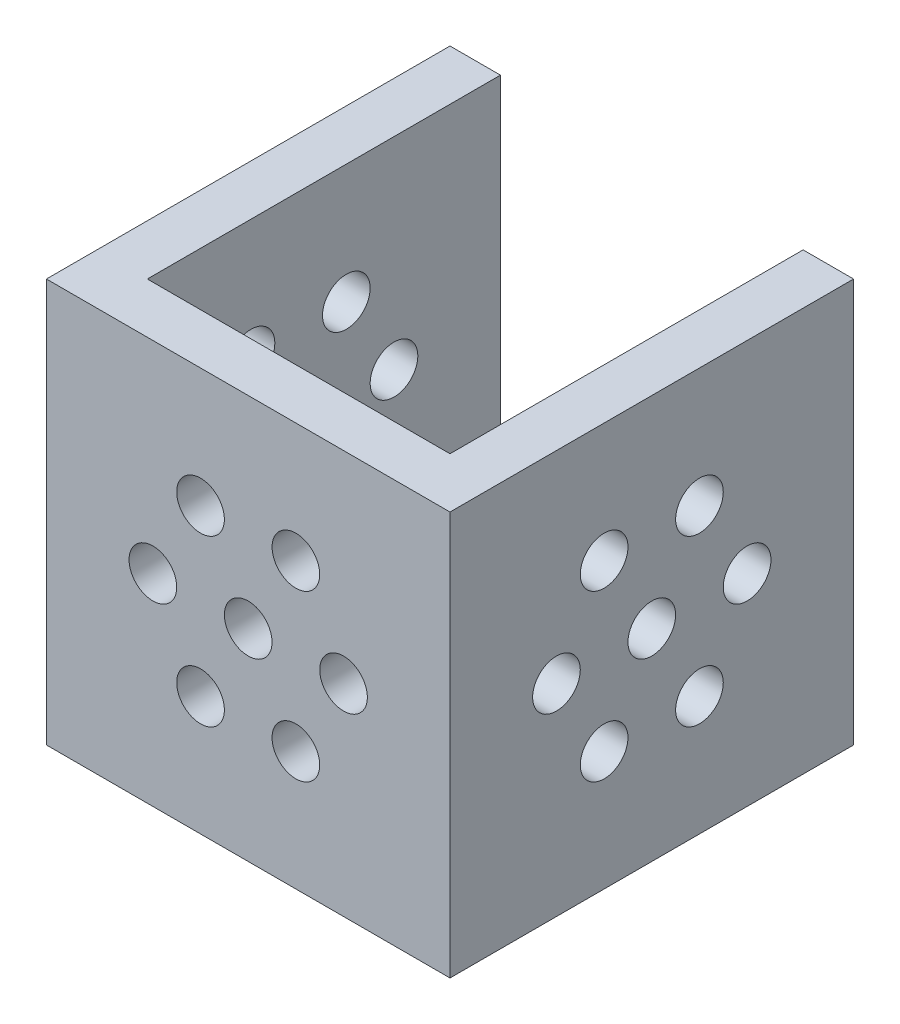
ISO-10303-21;
HEADER;
FILE_DESCRIPTION(('STEP AP214'),'2;1');
FILE_NAME('part.step','',(''),(''),'','','');
FILE_SCHEMA(('AUTOMOTIVE_DESIGN { 1 0 10303 214 1 1 1 1 }'));
ENDSEC;
DATA;
#1=APPLICATION_CONTEXT('core data for automotive mechanical design processes');
#2=APPLICATION_PROTOCOL_DEFINITION('international standard','automotive_design',2000,#1);
#3=PRODUCT_CONTEXT('',#1,'mechanical');
#4=PRODUCT('Part','Part','',(#3));
#5=PRODUCT_RELATED_PRODUCT_CATEGORY('part','',(#4));
#6=PRODUCT_DEFINITION_FORMATION('','',#4);
#7=PRODUCT_DEFINITION_CONTEXT('part definition',#1,'design');
#8=PRODUCT_DEFINITION('design','',#6,#7);
#9=PRODUCT_DEFINITION_SHAPE('','',#8);
#10=(LENGTH_UNIT() NAMED_UNIT(*) SI_UNIT(.MILLI.,.METRE.));
#11=(NAMED_UNIT(*) PLANE_ANGLE_UNIT() SI_UNIT($,.RADIAN.));
#12=(NAMED_UNIT(*) SI_UNIT($,.STERADIAN.) SOLID_ANGLE_UNIT());
#13=UNCERTAINTY_MEASURE_WITH_UNIT(LENGTH_MEASURE(1.E-05),#10,'distance_accuracy_value','');
#14=(GEOMETRIC_REPRESENTATION_CONTEXT(3) GLOBAL_UNCERTAINTY_ASSIGNED_CONTEXT((#13)) GLOBAL_UNIT_ASSIGNED_CONTEXT((#10,
#11,#12)) REPRESENTATION_CONTEXT('',''));
#15=CARTESIAN_POINT('',(0.,0.,0.));
#16=DIRECTION('',(0.,0.,1.));
#17=DIRECTION('',(1.,0.,0.));
#18=AXIS2_PLACEMENT_3D('',#15,#16,#17);
#19=CARTESIAN_POINT('',(22.225,25.4,0.));
#20=DIRECTION('',(-1.,0.,0.));
#21=DIRECTION('',(0.,0.,1.));
#22=AXIS2_PLACEMENT_3D('',#19,#20,#21);
#23=PLANE('',#22);
#24=CARTESIAN_POINT('',(22.225,12.7,-12.7));
#25=DIRECTION('',(-1.,0.,0.));
#26=DIRECTION('',(0.,0.,1.));
#27=AXIS2_PLACEMENT_3D('',#24,#25,#26);
#28=CIRCLE('',#27,1.5);
#29=CARTESIAN_POINT('',(22.225,12.7,-11.2));
#30=VERTEX_POINT('',#29);
#31=EDGE_CURVE('E214',#30,#30,#28,.T.);
#32=ORIENTED_EDGE('',*,*,#31,.F.);
#33=EDGE_LOOP('',(#32));
#34=FACE_BOUND('',#33,.T.);
#35=CARTESIAN_POINT('',(22.225,7.5038475772934,-9.69999999999994));
#36=DIRECTION('',(-1.,0.,0.));
#37=DIRECTION('',(0.,0.,1.));
#38=AXIS2_PLACEMENT_3D('',#35,#36,#37);
#39=CIRCLE('',#38,1.5);
#40=CARTESIAN_POINT('',(22.225,7.5038475772934,-8.19999999999995));
#41=VERTEX_POINT('',#40);
#42=EDGE_CURVE('E218',#41,#41,#39,.T.);
#43=ORIENTED_EDGE('',*,*,#42,.F.);
#44=EDGE_LOOP('',(#43));
#45=FACE_BOUND('',#44,.T.);
#46=CARTESIAN_POINT('',(22.225,7.50384757729334,-15.6999999999999));
#47=DIRECTION('',(-1.,0.,0.));
#48=DIRECTION('',(0.,0.,1.));
#49=AXIS2_PLACEMENT_3D('',#46,#47,#48);
#50=CIRCLE('',#49,1.5);
#51=CARTESIAN_POINT('',(22.225,7.50384757729334,-14.2));
#52=VERTEX_POINT('',#51);
#53=EDGE_CURVE('E222',#52,#52,#50,.T.);
#54=ORIENTED_EDGE('',*,*,#53,.F.);
#55=EDGE_LOOP('',(#54));
#56=FACE_BOUND('',#55,.T.);
#57=CARTESIAN_POINT('',(22.225,12.7,-18.7));
#58=DIRECTION('',(-1.,0.,0.));
#59=DIRECTION('',(0.,0.,1.));
#60=AXIS2_PLACEMENT_3D('',#57,#58,#59);
#61=CIRCLE('',#60,1.5);
#62=CARTESIAN_POINT('',(22.225,12.7,-17.2));
#63=VERTEX_POINT('',#62);
#64=EDGE_CURVE('E226',#63,#63,#61,.T.);
#65=ORIENTED_EDGE('',*,*,#64,.F.);
#66=EDGE_LOOP('',(#65));
#67=FACE_BOUND('',#66,.T.);
#68=CARTESIAN_POINT('',(22.225,12.7,-6.7));
#69=DIRECTION('',(-1.,0.,0.));
#70=DIRECTION('',(0.,0.,1.));
#71=AXIS2_PLACEMENT_3D('',#68,#69,#70);
#72=CIRCLE('',#71,1.5);
#73=CARTESIAN_POINT('',(22.225,12.7,-5.2));
#74=VERTEX_POINT('',#73);
#75=EDGE_CURVE('E230',#74,#74,#72,.T.);
#76=ORIENTED_EDGE('',*,*,#75,.F.);
#77=EDGE_LOOP('',(#76));
#78=FACE_BOUND('',#77,.T.);
#79=CARTESIAN_POINT('',(22.225,17.8961524227066,-9.70000000000001));
#80=DIRECTION('',(-1.,0.,0.));
#81=DIRECTION('',(0.,0.,1.));
#82=AXIS2_PLACEMENT_3D('',#79,#80,#81);
#83=CIRCLE('',#82,1.49999999999999);
#84=CARTESIAN_POINT('',(22.225,17.8961524227066,-8.20000000000002));
#85=VERTEX_POINT('',#84);
#86=EDGE_CURVE('E234',#85,#85,#83,.T.);
#87=ORIENTED_EDGE('',*,*,#86,.F.);
#88=EDGE_LOOP('',(#87));
#89=FACE_BOUND('',#88,.T.);
#90=CARTESIAN_POINT('',(22.225,17.8961524227066,-15.7));
#91=DIRECTION('',(-1.,0.,0.));
#92=DIRECTION('',(0.,0.,1.));
#93=AXIS2_PLACEMENT_3D('',#90,#91,#92);
#94=CIRCLE('',#93,1.5);
#95=CARTESIAN_POINT('',(22.225,17.8961524227066,-14.2));
#96=VERTEX_POINT('',#95);
#97=EDGE_CURVE('E237',#96,#96,#94,.T.);
#98=ORIENTED_EDGE('',*,*,#97,.F.);
#99=EDGE_LOOP('',(#98));
#100=FACE_BOUND('',#99,.T.);
#101=DIRECTION('',(0.,0.,-1.));
#102=VECTOR('',#101,1.);
#103=CARTESIAN_POINT('',(22.225,0.,0.));
#104=LINE('',#103,#102);
#105=CARTESIAN_POINT('',(22.225,0.,-3.175));
#106=VERTEX_POINT('',#105);
#107=CARTESIAN_POINT('',(22.225,0.,-25.4));
#108=VERTEX_POINT('',#107);
#109=EDGE_CURVE('E138',#106,#108,#104,.T.);
#110=ORIENTED_EDGE('',*,*,#109,.F.);
#111=DIRECTION('',(0.,-1.,0.));
#112=VECTOR('',#111,1.);
#113=CARTESIAN_POINT('',(22.225,25.4,-3.175));
#114=LINE('',#113,#112);
#115=CARTESIAN_POINT('',(22.225,25.4,-3.175));
#116=VERTEX_POINT('',#115);
#117=EDGE_CURVE('E12',#116,#106,#114,.T.);
#118=ORIENTED_EDGE('',*,*,#117,.F.);
#119=DIRECTION('',(0.,0.,-1.));
#120=VECTOR('',#119,1.);
#121=CARTESIAN_POINT('',(22.225,25.4,0.));
#122=LINE('',#121,#120);
#123=CARTESIAN_POINT('',(22.225,25.4,-25.4));
#124=VERTEX_POINT('',#123);
#125=EDGE_CURVE('E180',#116,#124,#122,.T.);
#126=ORIENTED_EDGE('',*,*,#125,.T.);
#127=DIRECTION('',(0.,-1.,0.));
#128=VECTOR('',#127,1.);
#129=CARTESIAN_POINT('',(22.225,25.4,-25.4));
#130=LINE('',#129,#128);
#131=EDGE_CURVE('E60',#124,#108,#130,.T.);
#132=ORIENTED_EDGE('',*,*,#131,.T.);
#133=EDGE_LOOP('',(#110,#118,#126,#132));
#134=FACE_BOUND('',#133,.T.);
#135=ADVANCED_FACE('F44',(#34,#45,#56,#67,#78,#89,#100,#134),#23,.T.);
#136=CARTESIAN_POINT('',(0.,25.4,-3.175));
#137=DIRECTION('',(0.,0.,-1.));
#138=DIRECTION('',(-1.,0.,0.));
#139=AXIS2_PLACEMENT_3D('',#136,#137,#138);
#140=PLANE('',#139);
#141=CARTESIAN_POINT('',(9.7,17.8961524227066,-3.175));
#142=DIRECTION('',(0.,0.,-1.));
#143=DIRECTION('',(-1.,0.,0.));
#144=AXIS2_PLACEMENT_3D('',#141,#142,#143);
#145=CIRCLE('',#144,1.5);
#146=CARTESIAN_POINT('',(8.2,17.8961524227066,-3.175));
#147=VERTEX_POINT('',#146);
#148=EDGE_CURVE('E141',#147,#147,#145,.T.);
#149=ORIENTED_EDGE('',*,*,#148,.F.);
#150=EDGE_LOOP('',(#149));
#151=FACE_BOUND('',#150,.T.);
#152=CARTESIAN_POINT('',(18.7,12.7,-3.175));
#153=DIRECTION('',(0.,0.,-1.));
#154=DIRECTION('',(-1.,0.,0.));
#155=AXIS2_PLACEMENT_3D('',#152,#153,#154);
#156=CIRCLE('',#155,1.5);
#157=CARTESIAN_POINT('',(17.2,12.7,-3.175));
#158=VERTEX_POINT('',#157);
#159=EDGE_CURVE('E305',#158,#158,#156,.T.);
#160=ORIENTED_EDGE('',*,*,#159,.F.);
#161=EDGE_LOOP('',(#160));
#162=FACE_BOUND('',#161,.T.);
#163=CARTESIAN_POINT('',(15.7,7.50384757729337,-3.175));
#164=DIRECTION('',(0.,0.,-1.));
#165=DIRECTION('',(-1.,0.,0.));
#166=AXIS2_PLACEMENT_3D('',#163,#164,#165);
#167=CIRCLE('',#166,1.49999999999999);
#168=CARTESIAN_POINT('',(14.2,7.50384757729337,-3.175));
#169=VERTEX_POINT('',#168);
#170=EDGE_CURVE('E303',#169,#169,#167,.T.);
#171=ORIENTED_EDGE('',*,*,#170,.F.);
#172=EDGE_LOOP('',(#171));
#173=FACE_BOUND('',#172,.T.);
#174=CARTESIAN_POINT('',(9.7,7.50384757729337,-3.175));
#175=DIRECTION('',(0.,0.,-1.));
#176=DIRECTION('',(-1.,0.,0.));
#177=AXIS2_PLACEMENT_3D('',#174,#175,#176);
#178=CIRCLE('',#177,1.5);
#179=CARTESIAN_POINT('',(8.2,7.50384757729337,-3.175));
#180=VERTEX_POINT('',#179);
#181=EDGE_CURVE('E300',#180,#180,#178,.T.);
#182=ORIENTED_EDGE('',*,*,#181,.F.);
#183=EDGE_LOOP('',(#182));
#184=FACE_BOUND('',#183,.T.);
#185=CARTESIAN_POINT('',(15.7,17.8961524227066,-3.175));
#186=DIRECTION('',(0.,0.,-1.));
#187=DIRECTION('',(-1.,0.,0.));
#188=AXIS2_PLACEMENT_3D('',#185,#186,#187);
#189=CIRCLE('',#188,1.49999999999999);
#190=CARTESIAN_POINT('',(14.2,17.8961524227066,-3.175));
#191=VERTEX_POINT('',#190);
#192=EDGE_CURVE('E297',#191,#191,#189,.T.);
#193=ORIENTED_EDGE('',*,*,#192,.F.);
#194=EDGE_LOOP('',(#193));
#195=FACE_BOUND('',#194,.T.);
#196=CARTESIAN_POINT('',(12.7,12.7,-3.175));
#197=DIRECTION('',(0.,0.,-1.));
#198=DIRECTION('',(-1.,0.,0.));
#199=AXIS2_PLACEMENT_3D('',#196,#197,#198);
#200=CIRCLE('',#199,1.5);
#201=CARTESIAN_POINT('',(11.2,12.7,-3.175));
#202=VERTEX_POINT('',#201);
#203=EDGE_CURVE('E294',#202,#202,#200,.T.);
#204=ORIENTED_EDGE('',*,*,#203,.F.);
#205=EDGE_LOOP('',(#204));
#206=FACE_BOUND('',#205,.T.);
#207=CARTESIAN_POINT('',(6.7,12.7,-3.175));
#208=DIRECTION('',(0.,0.,-1.));
#209=DIRECTION('',(-1.,0.,0.));
#210=AXIS2_PLACEMENT_3D('',#207,#208,#209);
#211=CIRCLE('',#210,1.5);
#212=CARTESIAN_POINT('',(5.2,12.7,-3.175));
#213=VERTEX_POINT('',#212);
#214=EDGE_CURVE('E291',#213,#213,#211,.T.);
#215=ORIENTED_EDGE('',*,*,#214,.F.);
#216=EDGE_LOOP('',(#215));
#217=FACE_BOUND('',#216,.T.);
#218=DIRECTION('',(1.,0.,0.));
#219=VECTOR('',#218,1.);
#220=CARTESIAN_POINT('',(0.,0.,-3.175));
#221=LINE('',#220,#219);
#222=CARTESIAN_POINT('',(3.175,0.,-3.175));
#223=VERTEX_POINT('',#222);
#224=EDGE_CURVE('E140',#223,#106,#221,.T.);
#225=ORIENTED_EDGE('',*,*,#224,.F.);
#226=DIRECTION('',(0.,-1.,0.));
#227=VECTOR('',#226,1.);
#228=CARTESIAN_POINT('',(3.175,25.4,-3.175));
#229=LINE('',#228,#227);
#230=CARTESIAN_POINT('',(3.175,25.4,-3.175));
#231=VERTEX_POINT('',#230);
#232=EDGE_CURVE('E52',#231,#223,#229,.T.);
#233=ORIENTED_EDGE('',*,*,#232,.F.);
#234=DIRECTION('',(1.,0.,0.));
#235=VECTOR('',#234,1.);
#236=CARTESIAN_POINT('',(0.,25.4,-3.175));
#237=LINE('',#236,#235);
#238=EDGE_CURVE('E177',#231,#116,#237,.T.);
#239=ORIENTED_EDGE('',*,*,#238,.T.);
#240=ORIENTED_EDGE('',*,*,#117,.T.);
#241=EDGE_LOOP('',(#225,#233,#239,#240));
#242=FACE_BOUND('',#241,.T.);
#243=ADVANCED_FACE('F176',(#151,#162,#173,#184,#195,#206,#217,#242),#140,.T.);
#244=CARTESIAN_POINT('',(3.175,25.4,0.));
#245=DIRECTION('',(-1.,0.,0.));
#246=DIRECTION('',(0.,0.,1.));
#247=AXIS2_PLACEMENT_3D('',#244,#245,#246);
#248=PLANE('',#247);
#249=CARTESIAN_POINT('',(3.175,12.7,-12.7));
#250=DIRECTION('',(-1.,0.,0.));
#251=DIRECTION('',(0.,0.,1.));
#252=AXIS2_PLACEMENT_3D('',#249,#250,#251);
#253=CIRCLE('',#252,1.5);
#254=CARTESIAN_POINT('',(3.175,12.7,-11.2));
#255=VERTEX_POINT('',#254);
#256=EDGE_CURVE('E266',#255,#255,#253,.T.);
#257=ORIENTED_EDGE('',*,*,#256,.T.);
#258=EDGE_LOOP('',(#257));
#259=FACE_BOUND('',#258,.T.);
#260=CARTESIAN_POINT('',(3.175,7.5038475772934,-9.69999999999994));
#261=DIRECTION('',(-1.,0.,0.));
#262=DIRECTION('',(0.,0.,1.));
#263=AXIS2_PLACEMENT_3D('',#260,#261,#262);
#264=CIRCLE('',#263,1.5);
#265=CARTESIAN_POINT('',(3.175,7.5038475772934,-8.19999999999995));
#266=VERTEX_POINT('',#265);
#267=EDGE_CURVE('E262',#266,#266,#264,.T.);
#268=ORIENTED_EDGE('',*,*,#267,.T.);
#269=EDGE_LOOP('',(#268));
#270=FACE_BOUND('',#269,.T.);
#271=CARTESIAN_POINT('',(3.175,7.50384757729334,-15.6999999999999));
#272=DIRECTION('',(-1.,0.,0.));
#273=DIRECTION('',(0.,0.,1.));
#274=AXIS2_PLACEMENT_3D('',#271,#272,#273);
#275=CIRCLE('',#274,1.5);
#276=CARTESIAN_POINT('',(3.175,7.50384757729334,-14.2));
#277=VERTEX_POINT('',#276);
#278=EDGE_CURVE('E258',#277,#277,#275,.T.);
#279=ORIENTED_EDGE('',*,*,#278,.T.);
#280=EDGE_LOOP('',(#279));
#281=FACE_BOUND('',#280,.T.);
#282=CARTESIAN_POINT('',(3.175,12.7,-18.7));
#283=DIRECTION('',(-1.,0.,0.));
#284=DIRECTION('',(0.,0.,1.));
#285=AXIS2_PLACEMENT_3D('',#282,#283,#284);
#286=CIRCLE('',#285,1.5);
#287=CARTESIAN_POINT('',(3.175,12.7,-17.2));
#288=VERTEX_POINT('',#287);
#289=EDGE_CURVE('E254',#288,#288,#286,.T.);
#290=ORIENTED_EDGE('',*,*,#289,.T.);
#291=EDGE_LOOP('',(#290));
#292=FACE_BOUND('',#291,.T.);
#293=CARTESIAN_POINT('',(3.175,12.7,-6.7));
#294=DIRECTION('',(-1.,0.,0.));
#295=DIRECTION('',(0.,0.,1.));
#296=AXIS2_PLACEMENT_3D('',#293,#294,#295);
#297=CIRCLE('',#296,1.5);
#298=CARTESIAN_POINT('',(3.175,12.7,-5.2));
#299=VERTEX_POINT('',#298);
#300=EDGE_CURVE('E250',#299,#299,#297,.T.);
#301=ORIENTED_EDGE('',*,*,#300,.T.);
#302=EDGE_LOOP('',(#301));
#303=FACE_BOUND('',#302,.T.);
#304=CARTESIAN_POINT('',(3.175,17.8961524227066,-9.70000000000001));
#305=DIRECTION('',(-1.,0.,0.));
#306=DIRECTION('',(0.,0.,1.));
#307=AXIS2_PLACEMENT_3D('',#304,#305,#306);
#308=CIRCLE('',#307,1.49999999999999);
#309=CARTESIAN_POINT('',(3.175,17.8961524227066,-8.20000000000002));
#310=VERTEX_POINT('',#309);
#311=EDGE_CURVE('E239',#310,#310,#308,.T.);
#312=ORIENTED_EDGE('',*,*,#311,.T.);
#313=EDGE_LOOP('',(#312));
#314=FACE_BOUND('',#313,.T.);
#315=CARTESIAN_POINT('',(3.175,17.8961524227066,-15.7));
#316=DIRECTION('',(-1.,0.,0.));
#317=DIRECTION('',(0.,0.,1.));
#318=AXIS2_PLACEMENT_3D('',#315,#316,#317);
#319=CIRCLE('',#318,1.5);
#320=CARTESIAN_POINT('',(3.175,17.8961524227066,-14.2));
#321=VERTEX_POINT('',#320);
#322=EDGE_CURVE('E240',#321,#321,#319,.T.);
#323=ORIENTED_EDGE('',*,*,#322,.T.);
#324=EDGE_LOOP('',(#323));
#325=FACE_BOUND('',#324,.T.);
#326=DIRECTION('',(0.,0.,-1.));
#327=VECTOR('',#326,1.);
#328=CARTESIAN_POINT('',(3.175,0.,0.));
#329=LINE('',#328,#327);
#330=CARTESIAN_POINT('',(3.175,0.,-25.4));
#331=VERTEX_POINT('',#330);
#332=EDGE_CURVE('E144',#223,#331,#329,.T.);
#333=ORIENTED_EDGE('',*,*,#332,.T.);
#334=DIRECTION('',(0.,-1.,0.));
#335=VECTOR('',#334,1.);
#336=CARTESIAN_POINT('',(3.175,25.4,-25.4));
#337=LINE('',#336,#335);
#338=CARTESIAN_POINT('',(3.175,25.4,-25.4));
#339=VERTEX_POINT('',#338);
#340=EDGE_CURVE('E162',#339,#331,#337,.T.);
#341=ORIENTED_EDGE('',*,*,#340,.F.);
#342=DIRECTION('',(0.,0.,-1.));
#343=VECTOR('',#342,1.);
#344=CARTESIAN_POINT('',(3.175,25.4,0.));
#345=LINE('',#344,#343);
#346=EDGE_CURVE('E168',#231,#339,#345,.T.);
#347=ORIENTED_EDGE('',*,*,#346,.F.);
#348=ORIENTED_EDGE('',*,*,#232,.T.);
#349=EDGE_LOOP('',(#333,#341,#347,#348));
#350=FACE_BOUND('',#349,.T.);
#351=ADVANCED_FACE('F166',(#259,#270,#281,#292,#303,#314,#325,#350),#248,.F.);
#352=CARTESIAN_POINT('',(0.,25.4,-25.4));
#353=DIRECTION('',(0.,0.,-1.));
#354=DIRECTION('',(-1.,0.,0.));
#355=AXIS2_PLACEMENT_3D('',#352,#353,#354);
#356=PLANE('',#355);
#357=DIRECTION('',(1.,0.,0.));
#358=VECTOR('',#357,1.);
#359=CARTESIAN_POINT('',(0.,0.,-25.4));
#360=LINE('',#359,#358);
#361=CARTESIAN_POINT('',(0.,0.,-25.4));
#362=VERTEX_POINT('',#361);
#363=EDGE_CURVE('E147',#362,#331,#360,.T.);
#364=ORIENTED_EDGE('',*,*,#363,.F.);
#365=DIRECTION('',(0.,-1.,0.));
#366=VECTOR('',#365,1.);
#367=CARTESIAN_POINT('',(0.,25.4,-25.4));
#368=LINE('',#367,#366);
#369=CARTESIAN_POINT('',(0.,25.4,-25.4));
#370=VERTEX_POINT('',#369);
#371=EDGE_CURVE('E160',#370,#362,#368,.T.);
#372=ORIENTED_EDGE('',*,*,#371,.F.);
#373=DIRECTION('',(1.,0.,0.));
#374=VECTOR('',#373,1.);
#375=CARTESIAN_POINT('',(0.,25.4,-25.4));
#376=LINE('',#375,#374);
#377=EDGE_CURVE('E135',#370,#339,#376,.T.);
#378=ORIENTED_EDGE('',*,*,#377,.T.);
#379=ORIENTED_EDGE('',*,*,#340,.T.);
#380=EDGE_LOOP('',(#364,#372,#378,#379));
#381=FACE_BOUND('',#380,.T.);
#382=ADVANCED_FACE('F191',(#381),#356,.T.);
#383=CARTESIAN_POINT('',(0.,25.4,0.));
#384=DIRECTION('',(-1.,0.,0.));
#385=DIRECTION('',(0.,0.,1.));
#386=AXIS2_PLACEMENT_3D('',#383,#384,#385);
#387=PLANE('',#386);
#388=CARTESIAN_POINT('',(0.,12.7,-12.7));
#389=DIRECTION('',(1.,0.,0.));
#390=DIRECTION('',(0.,0.,-1.));
#391=AXIS2_PLACEMENT_3D('',#388,#389,#390);
#392=CIRCLE('',#391,1.5);
#393=CARTESIAN_POINT('',(0.,12.7,-14.2));
#394=VERTEX_POINT('',#393);
#395=EDGE_CURVE('E588',#394,#394,#392,.T.);
#396=ORIENTED_EDGE('',*,*,#395,.T.);
#397=EDGE_LOOP('',(#396));
#398=FACE_BOUND('',#397,.T.);
#399=CARTESIAN_POINT('',(0.,7.5038475772934,-9.69999999999994));
#400=DIRECTION('',(1.,0.,0.));
#401=DIRECTION('',(0.,0.,-1.));
#402=AXIS2_PLACEMENT_3D('',#399,#400,#401);
#403=CIRCLE('',#402,1.5);
#404=CARTESIAN_POINT('',(0.,7.5038475772934,-11.1999999999999));
#405=VERTEX_POINT('',#404);
#406=EDGE_CURVE('E612',#405,#405,#403,.T.);
#407=ORIENTED_EDGE('',*,*,#406,.T.);
#408=EDGE_LOOP('',(#407));
#409=FACE_BOUND('',#408,.T.);
#410=CARTESIAN_POINT('',(0.,7.50384757729334,-15.6999999999999));
#411=DIRECTION('',(1.,0.,0.));
#412=DIRECTION('',(0.,0.,-1.));
#413=AXIS2_PLACEMENT_3D('',#410,#411,#412);
#414=CIRCLE('',#413,1.5);
#415=CARTESIAN_POINT('',(0.,7.50384757729334,-17.1999999999999));
#416=VERTEX_POINT('',#415);
#417=EDGE_CURVE('E626',#416,#416,#414,.T.);
#418=ORIENTED_EDGE('',*,*,#417,.T.);
#419=EDGE_LOOP('',(#418));
#420=FACE_BOUND('',#419,.T.);
#421=CARTESIAN_POINT('',(0.,12.7,-18.7));
#422=DIRECTION('',(1.,0.,0.));
#423=DIRECTION('',(0.,0.,-1.));
#424=AXIS2_PLACEMENT_3D('',#421,#422,#423);
#425=CIRCLE('',#424,1.5);
#426=CARTESIAN_POINT('',(0.,12.7,-20.2));
#427=VERTEX_POINT('',#426);
#428=EDGE_CURVE('E619',#427,#427,#425,.T.);
#429=ORIENTED_EDGE('',*,*,#428,.T.);
#430=EDGE_LOOP('',(#429));
#431=FACE_BOUND('',#430,.T.);
#432=CARTESIAN_POINT('',(0.,12.7,-6.7));
#433=DIRECTION('',(1.,0.,0.));
#434=DIRECTION('',(0.,0.,-1.));
#435=AXIS2_PLACEMENT_3D('',#432,#433,#434);
#436=CIRCLE('',#435,1.5);
#437=CARTESIAN_POINT('',(0.,12.7,-8.2));
#438=VERTEX_POINT('',#437);
#439=EDGE_CURVE('E615',#438,#438,#436,.T.);
#440=ORIENTED_EDGE('',*,*,#439,.T.);
#441=EDGE_LOOP('',(#440));
#442=FACE_BOUND('',#441,.T.);
#443=CARTESIAN_POINT('',(0.,17.8961524227066,-9.70000000000001));
#444=DIRECTION('',(1.,0.,0.));
#445=DIRECTION('',(0.,0.,-1.));
#446=AXIS2_PLACEMENT_3D('',#443,#444,#445);
#447=CIRCLE('',#446,1.49999999999999);
#448=CARTESIAN_POINT('',(0.,17.8961524227066,-11.2));
#449=VERTEX_POINT('',#448);
#450=EDGE_CURVE('E648',#449,#449,#447,.T.);
#451=ORIENTED_EDGE('',*,*,#450,.T.);
#452=EDGE_LOOP('',(#451));
#453=FACE_BOUND('',#452,.T.);
#454=CARTESIAN_POINT('',(0.,17.8961524227066,-15.7));
#455=DIRECTION('',(1.,0.,0.));
#456=DIRECTION('',(0.,0.,-1.));
#457=AXIS2_PLACEMENT_3D('',#454,#455,#456);
#458=CIRCLE('',#457,1.5);
#459=CARTESIAN_POINT('',(0.,17.8961524227066,-17.2));
#460=VERTEX_POINT('',#459);
#461=EDGE_CURVE('E245',#460,#460,#458,.T.);
#462=ORIENTED_EDGE('',*,*,#461,.T.);
#463=EDGE_LOOP('',(#462));
#464=FACE_BOUND('',#463,.T.);
#465=DIRECTION('',(0.,0.,-1.));
#466=VECTOR('',#465,1.);
#467=CARTESIAN_POINT('',(0.,0.,0.));
#468=LINE('',#467,#466);
#469=CARTESIAN_POINT('',(0.,0.,0.));
#470=VERTEX_POINT('',#469);
#471=EDGE_CURVE('E150',#470,#362,#468,.T.);
#472=ORIENTED_EDGE('',*,*,#471,.F.);
#473=DIRECTION('',(0.,-1.,0.));
#474=VECTOR('',#473,1.);
#475=CARTESIAN_POINT('',(0.,25.4,0.));
#476=LINE('',#475,#474);
#477=CARTESIAN_POINT('',(0.,25.4,0.));
#478=VERTEX_POINT('',#477);
#479=EDGE_CURVE('E129',#478,#470,#476,.T.);
#480=ORIENTED_EDGE('',*,*,#479,.F.);
#481=DIRECTION('',(0.,0.,-1.));
#482=VECTOR('',#481,1.);
#483=CARTESIAN_POINT('',(0.,25.4,0.));
#484=LINE('',#483,#482);
#485=EDGE_CURVE('E119',#478,#370,#484,.T.);
#486=ORIENTED_EDGE('',*,*,#485,.T.);
#487=ORIENTED_EDGE('',*,*,#371,.T.);
#488=EDGE_LOOP('',(#472,#480,#486,#487));
#489=FACE_BOUND('',#488,.T.);
#490=ADVANCED_FACE('F189',(#398,#409,#420,#431,#442,#453,#464,#489),#387,.T.);
#491=CARTESIAN_POINT('',(0.,25.4,0.));
#492=DIRECTION('',(0.,0.,-1.));
#493=DIRECTION('',(-1.,0.,0.));
#494=AXIS2_PLACEMENT_3D('',#491,#492,#493);
#495=PLANE('',#494);
#496=CARTESIAN_POINT('',(9.7,17.8961524227066,0.));
#497=DIRECTION('',(0.,0.,1.));
#498=DIRECTION('',(1.,0.,0.));
#499=AXIS2_PLACEMENT_3D('',#496,#497,#498);
#500=CIRCLE('',#499,1.5);
#501=CARTESIAN_POINT('',(11.2,17.8961524227066,0.));
#502=VERTEX_POINT('',#501);
#503=EDGE_CURVE('E277',#502,#502,#500,.T.);
#504=ORIENTED_EDGE('',*,*,#503,.F.);
#505=EDGE_LOOP('',(#504));
#506=FACE_BOUND('',#505,.T.);
#507=CARTESIAN_POINT('',(18.7,12.7,0.));
#508=DIRECTION('',(0.,0.,1.));
#509=DIRECTION('',(1.,0.,0.));
#510=AXIS2_PLACEMENT_3D('',#507,#508,#509);
#511=CIRCLE('',#510,1.5);
#512=CARTESIAN_POINT('',(20.2,12.7,0.));
#513=VERTEX_POINT('',#512);
#514=EDGE_CURVE('E281',#513,#513,#511,.T.);
#515=ORIENTED_EDGE('',*,*,#514,.F.);
#516=EDGE_LOOP('',(#515));
#517=FACE_BOUND('',#516,.T.);
#518=CARTESIAN_POINT('',(15.7,7.50384757729337,0.));
#519=DIRECTION('',(0.,0.,1.));
#520=DIRECTION('',(1.,0.,0.));
#521=AXIS2_PLACEMENT_3D('',#518,#519,#520);
#522=CIRCLE('',#521,1.49999999999999);
#523=CARTESIAN_POINT('',(17.2,7.50384757729337,0.));
#524=VERTEX_POINT('',#523);
#525=EDGE_CURVE('E284',#524,#524,#522,.T.);
#526=ORIENTED_EDGE('',*,*,#525,.F.);
#527=EDGE_LOOP('',(#526));
#528=FACE_BOUND('',#527,.T.);
#529=CARTESIAN_POINT('',(9.7,7.50384757729337,0.));
#530=DIRECTION('',(0.,0.,1.));
#531=DIRECTION('',(1.,0.,0.));
#532=AXIS2_PLACEMENT_3D('',#529,#530,#531);
#533=CIRCLE('',#532,1.5);
#534=CARTESIAN_POINT('',(11.2,7.50384757729337,0.));
#535=VERTEX_POINT('',#534);
#536=EDGE_CURVE('E274',#535,#535,#533,.T.);
#537=ORIENTED_EDGE('',*,*,#536,.F.);
#538=EDGE_LOOP('',(#537));
#539=FACE_BOUND('',#538,.T.);
#540=CARTESIAN_POINT('',(15.7,17.8961524227066,0.));
#541=DIRECTION('',(0.,0.,1.));
#542=DIRECTION('',(1.,0.,0.));
#543=AXIS2_PLACEMENT_3D('',#540,#541,#542);
#544=CIRCLE('',#543,1.49999999999999);
#545=CARTESIAN_POINT('',(17.2,17.8961524227066,0.));
#546=VERTEX_POINT('',#545);
#547=EDGE_CURVE('E271',#546,#546,#544,.T.);
#548=ORIENTED_EDGE('',*,*,#547,.F.);
#549=EDGE_LOOP('',(#548));
#550=FACE_BOUND('',#549,.T.);
#551=CARTESIAN_POINT('',(12.7,12.7,0.));
#552=DIRECTION('',(0.,0.,1.));
#553=DIRECTION('',(1.,0.,0.));
#554=AXIS2_PLACEMENT_3D('',#551,#552,#553);
#555=CIRCLE('',#554,1.5);
#556=CARTESIAN_POINT('',(14.2,12.7,0.));
#557=VERTEX_POINT('',#556);
#558=EDGE_CURVE('E270',#557,#557,#555,.T.);
#559=ORIENTED_EDGE('',*,*,#558,.F.);
#560=EDGE_LOOP('',(#559));
#561=FACE_BOUND('',#560,.T.);
#562=CARTESIAN_POINT('',(6.7,12.7,0.));
#563=DIRECTION('',(0.,0.,1.));
#564=DIRECTION('',(1.,0.,0.));
#565=AXIS2_PLACEMENT_3D('',#562,#563,#564);
#566=CIRCLE('',#565,1.5);
#567=CARTESIAN_POINT('',(8.2,12.7,0.));
#568=VERTEX_POINT('',#567);
#569=EDGE_CURVE('E280',#568,#568,#566,.T.);
#570=ORIENTED_EDGE('',*,*,#569,.F.);
#571=EDGE_LOOP('',(#570));
#572=FACE_BOUND('',#571,.T.);
#573=DIRECTION('',(1.,0.,0.));
#574=VECTOR('',#573,1.);
#575=CARTESIAN_POINT('',(0.,0.,0.));
#576=LINE('',#575,#574);
#577=CARTESIAN_POINT('',(25.4,0.,0.));
#578=VERTEX_POINT('',#577);
#579=EDGE_CURVE('E126',#470,#578,#576,.T.);
#580=ORIENTED_EDGE('',*,*,#579,.T.);
#581=DIRECTION('',(0.,-1.,0.));
#582=VECTOR('',#581,1.);
#583=CARTESIAN_POINT('',(25.4,25.4,0.));
#584=LINE('',#583,#582);
#585=CARTESIAN_POINT('',(25.4,25.4,0.));
#586=VERTEX_POINT('',#585);
#587=EDGE_CURVE('E123',#586,#578,#584,.T.);
#588=ORIENTED_EDGE('',*,*,#587,.F.);
#589=DIRECTION('',(1.,0.,0.));
#590=VECTOR('',#589,1.);
#591=CARTESIAN_POINT('',(0.,25.4,0.));
#592=LINE('',#591,#590);
#593=EDGE_CURVE('E111',#478,#586,#592,.T.);
#594=ORIENTED_EDGE('',*,*,#593,.F.);
#595=ORIENTED_EDGE('',*,*,#479,.T.);
#596=EDGE_LOOP('',(#580,#588,#594,#595));
#597=FACE_BOUND('',#596,.T.);
#598=ADVANCED_FACE('F124',(#506,#517,#528,#539,#550,#561,#572,#597),#495,.F.);
#599=CARTESIAN_POINT('',(25.4,25.4,0.));
#600=DIRECTION('',(-1.,0.,0.));
#601=DIRECTION('',(0.,0.,1.));
#602=AXIS2_PLACEMENT_3D('',#599,#600,#601);
#603=PLANE('',#602);
#604=CARTESIAN_POINT('',(25.4,12.7,-12.7));
#605=DIRECTION('',(1.,0.,0.));
#606=DIRECTION('',(0.,0.,-1.));
#607=AXIS2_PLACEMENT_3D('',#604,#605,#606);
#608=CIRCLE('',#607,1.5);
#609=CARTESIAN_POINT('',(25.4,12.7,-14.2));
#610=VERTEX_POINT('',#609);
#611=EDGE_CURVE('E609',#610,#610,#608,.T.);
#612=ORIENTED_EDGE('',*,*,#611,.F.);
#613=EDGE_LOOP('',(#612));
#614=FACE_BOUND('',#613,.T.);
#615=CARTESIAN_POINT('',(25.4,7.5038475772934,-9.69999999999994));
#616=DIRECTION('',(1.,0.,0.));
#617=DIRECTION('',(0.,0.,-1.));
#618=AXIS2_PLACEMENT_3D('',#615,#616,#617);
#619=CIRCLE('',#618,1.5);
#620=CARTESIAN_POINT('',(25.4,7.5038475772934,-11.1999999999999));
#621=VERTEX_POINT('',#620);
#622=EDGE_CURVE('E608',#621,#621,#619,.T.);
#623=ORIENTED_EDGE('',*,*,#622,.F.);
#624=EDGE_LOOP('',(#623));
#625=FACE_BOUND('',#624,.T.);
#626=CARTESIAN_POINT('',(25.4,7.50384757729334,-15.6999999999999));
#627=DIRECTION('',(1.,0.,0.));
#628=DIRECTION('',(0.,0.,-1.));
#629=AXIS2_PLACEMENT_3D('',#626,#627,#628);
#630=CIRCLE('',#629,1.5);
#631=CARTESIAN_POINT('',(25.4,7.50384757729334,-17.1999999999999));
#632=VERTEX_POINT('',#631);
#633=EDGE_CURVE('E629',#632,#632,#630,.T.);
#634=ORIENTED_EDGE('',*,*,#633,.F.);
#635=EDGE_LOOP('',(#634));
#636=FACE_BOUND('',#635,.T.);
#637=CARTESIAN_POINT('',(25.4,12.7,-18.7));
#638=DIRECTION('',(1.,0.,0.));
#639=DIRECTION('',(0.,0.,-1.));
#640=AXIS2_PLACEMENT_3D('',#637,#638,#639);
#641=CIRCLE('',#640,1.5);
#642=CARTESIAN_POINT('',(25.4,12.7,-20.2));
#643=VERTEX_POINT('',#642);
#644=EDGE_CURVE('E623',#643,#643,#641,.T.);
#645=ORIENTED_EDGE('',*,*,#644,.F.);
#646=EDGE_LOOP('',(#645));
#647=FACE_BOUND('',#646,.T.);
#648=CARTESIAN_POINT('',(25.4,12.7,-6.7));
#649=DIRECTION('',(1.,0.,0.));
#650=DIRECTION('',(0.,0.,-1.));
#651=AXIS2_PLACEMENT_3D('',#648,#649,#650);
#652=CIRCLE('',#651,1.5);
#653=CARTESIAN_POINT('',(25.4,12.7,-8.2));
#654=VERTEX_POINT('',#653);
#655=EDGE_CURVE('E651',#654,#654,#652,.T.);
#656=ORIENTED_EDGE('',*,*,#655,.F.);
#657=EDGE_LOOP('',(#656));
#658=FACE_BOUND('',#657,.T.);
#659=CARTESIAN_POINT('',(25.4,17.8961524227066,-9.70000000000001));
#660=DIRECTION('',(1.,0.,0.));
#661=DIRECTION('',(0.,0.,-1.));
#662=AXIS2_PLACEMENT_3D('',#659,#660,#661);
#663=CIRCLE('',#662,1.49999999999999);
#664=CARTESIAN_POINT('',(25.4,17.8961524227066,-11.2));
#665=VERTEX_POINT('',#664);
#666=EDGE_CURVE('E645',#665,#665,#663,.T.);
#667=ORIENTED_EDGE('',*,*,#666,.F.);
#668=EDGE_LOOP('',(#667));
#669=FACE_BOUND('',#668,.T.);
#670=CARTESIAN_POINT('',(25.4,17.8961524227066,-15.7));
#671=DIRECTION('',(1.,0.,0.));
#672=DIRECTION('',(0.,0.,-1.));
#673=AXIS2_PLACEMENT_3D('',#670,#671,#672);
#674=CIRCLE('',#673,1.5);
#675=CARTESIAN_POINT('',(25.4,17.8961524227066,-17.2));
#676=VERTEX_POINT('',#675);
#677=EDGE_CURVE('E622',#676,#676,#674,.T.);
#678=ORIENTED_EDGE('',*,*,#677,.F.);
#679=EDGE_LOOP('',(#678));
#680=FACE_BOUND('',#679,.T.);
#681=DIRECTION('',(0.,0.,-1.));
#682=VECTOR('',#681,1.);
#683=CARTESIAN_POINT('',(25.4,0.,0.));
#684=LINE('',#683,#682);
#685=CARTESIAN_POINT('',(25.4,0.,-25.4));
#686=VERTEX_POINT('',#685);
#687=EDGE_CURVE('E155',#578,#686,#684,.T.);
#688=ORIENTED_EDGE('',*,*,#687,.T.);
#689=DIRECTION('',(0.,-1.,0.));
#690=VECTOR('',#689,1.);
#691=CARTESIAN_POINT('',(25.4,25.4,-25.4));
#692=LINE('',#691,#690);
#693=CARTESIAN_POINT('',(25.4,25.4,-25.4));
#694=VERTEX_POINT('',#693);
#695=EDGE_CURVE('E86',#694,#686,#692,.T.);
#696=ORIENTED_EDGE('',*,*,#695,.F.);
#697=DIRECTION('',(0.,0.,-1.));
#698=VECTOR('',#697,1.);
#699=CARTESIAN_POINT('',(25.4,25.4,0.));
#700=LINE('',#699,#698);
#701=EDGE_CURVE('E116',#586,#694,#700,.T.);
#702=ORIENTED_EDGE('',*,*,#701,.F.);
#703=ORIENTED_EDGE('',*,*,#587,.T.);
#704=EDGE_LOOP('',(#688,#696,#702,#703));
#705=FACE_BOUND('',#704,.T.);
#706=ADVANCED_FACE('F131',(#614,#625,#636,#647,#658,#669,#680,#705),#603,.F.);
#707=EDGE_CURVE('E151',#108,#686,#360,.T.);
#708=ORIENTED_EDGE('',*,*,#707,.F.);
#709=ORIENTED_EDGE('',*,*,#131,.F.);
#710=EDGE_CURVE('E132',#124,#694,#376,.T.);
#711=ORIENTED_EDGE('',*,*,#710,.T.);
#712=ORIENTED_EDGE('',*,*,#695,.T.);
#713=EDGE_LOOP('',(#708,#709,#711,#712));
#714=FACE_BOUND('',#713,.T.);
#715=ADVANCED_FACE('F179',(#714),#356,.T.);
#716=CARTESIAN_POINT('',(0.,25.4,0.));
#717=DIRECTION('',(0.,1.,0.));
#718=DIRECTION('',(0.,0.,1.));
#719=AXIS2_PLACEMENT_3D('',#716,#717,#718);
#720=PLANE('',#719);
#721=ORIENTED_EDGE('',*,*,#125,.F.);
#722=ORIENTED_EDGE('',*,*,#238,.F.);
#723=ORIENTED_EDGE('',*,*,#346,.T.);
#724=ORIENTED_EDGE('',*,*,#377,.F.);
#725=ORIENTED_EDGE('',*,*,#485,.F.);
#726=ORIENTED_EDGE('',*,*,#593,.T.);
#727=ORIENTED_EDGE('',*,*,#701,.T.);
#728=ORIENTED_EDGE('',*,*,#710,.F.);
#729=EDGE_LOOP('',(#721,#722,#723,#724,#725,#726,#727,#728));
#730=FACE_BOUND('',#729,.T.);
#731=ADVANCED_FACE('F113',(#730),#720,.T.);
#732=CARTESIAN_POINT('',(0.,0.,0.));
#733=DIRECTION('',(0.,1.,0.));
#734=DIRECTION('',(0.,0.,1.));
#735=AXIS2_PLACEMENT_3D('',#732,#733,#734);
#736=PLANE('',#735);
#737=ORIENTED_EDGE('',*,*,#109,.T.);
#738=ORIENTED_EDGE('',*,*,#707,.T.);
#739=ORIENTED_EDGE('',*,*,#687,.F.);
#740=ORIENTED_EDGE('',*,*,#579,.F.);
#741=ORIENTED_EDGE('',*,*,#471,.T.);
#742=ORIENTED_EDGE('',*,*,#363,.T.);
#743=ORIENTED_EDGE('',*,*,#332,.F.);
#744=ORIENTED_EDGE('',*,*,#224,.T.);
#745=EDGE_LOOP('',(#737,#738,#739,#740,#741,#742,#743,#744));
#746=FACE_BOUND('',#745,.T.);
#747=ADVANCED_FACE('F174',(#746),#736,.F.);
#748=CARTESIAN_POINT('',(6.7,12.7,-25.4));
#749=DIRECTION('',(0.,0.,1.));
#750=DIRECTION('',(1.,0.,0.));
#751=AXIS2_PLACEMENT_3D('',#748,#749,#750);
#752=CYLINDRICAL_SURFACE('',#751,1.5);
#753=ORIENTED_EDGE('',*,*,#214,.T.);
#754=EDGE_LOOP('',(#753));
#755=FACE_BOUND('',#754,.T.);
#756=ORIENTED_EDGE('',*,*,#569,.T.);
#757=EDGE_LOOP('',(#756));
#758=FACE_BOUND('',#757,.T.);
#759=ADVANCED_FACE('F326',(#755,#758),#752,.F.);
#760=CARTESIAN_POINT('',(12.7,12.7,-25.4));
#761=DIRECTION('',(0.,0.,1.));
#762=DIRECTION('',(1.,0.,0.));
#763=AXIS2_PLACEMENT_3D('',#760,#761,#762);
#764=CYLINDRICAL_SURFACE('',#763,1.5);
#765=ORIENTED_EDGE('',*,*,#203,.T.);
#766=EDGE_LOOP('',(#765));
#767=FACE_BOUND('',#766,.T.);
#768=ORIENTED_EDGE('',*,*,#558,.T.);
#769=EDGE_LOOP('',(#768));
#770=FACE_BOUND('',#769,.T.);
#771=ADVANCED_FACE('F329',(#767,#770),#764,.F.);
#772=CARTESIAN_POINT('',(15.7,17.8961524227066,-25.4));
#773=DIRECTION('',(0.,0.,1.));
#774=DIRECTION('',(1.,0.,0.));
#775=AXIS2_PLACEMENT_3D('',#772,#773,#774);
#776=CYLINDRICAL_SURFACE('',#775,1.49999999999999);
#777=ORIENTED_EDGE('',*,*,#192,.T.);
#778=EDGE_LOOP('',(#777));
#779=FACE_BOUND('',#778,.T.);
#780=ORIENTED_EDGE('',*,*,#547,.T.);
#781=EDGE_LOOP('',(#780));
#782=FACE_BOUND('',#781,.T.);
#783=ADVANCED_FACE('F353',(#779,#782),#776,.F.);
#784=CARTESIAN_POINT('',(9.7,7.50384757729337,-25.4));
#785=DIRECTION('',(0.,0.,1.));
#786=DIRECTION('',(1.,0.,0.));
#787=AXIS2_PLACEMENT_3D('',#784,#785,#786);
#788=CYLINDRICAL_SURFACE('',#787,1.5);
#789=ORIENTED_EDGE('',*,*,#181,.T.);
#790=EDGE_LOOP('',(#789));
#791=FACE_BOUND('',#790,.T.);
#792=ORIENTED_EDGE('',*,*,#536,.T.);
#793=EDGE_LOOP('',(#792));
#794=FACE_BOUND('',#793,.T.);
#795=ADVANCED_FACE('F359',(#791,#794),#788,.F.);
#796=CARTESIAN_POINT('',(15.7,7.50384757729337,-25.4));
#797=DIRECTION('',(0.,0.,1.));
#798=DIRECTION('',(1.,0.,0.));
#799=AXIS2_PLACEMENT_3D('',#796,#797,#798);
#800=CYLINDRICAL_SURFACE('',#799,1.49999999999999);
#801=ORIENTED_EDGE('',*,*,#170,.T.);
#802=EDGE_LOOP('',(#801));
#803=FACE_BOUND('',#802,.T.);
#804=ORIENTED_EDGE('',*,*,#525,.T.);
#805=EDGE_LOOP('',(#804));
#806=FACE_BOUND('',#805,.T.);
#807=ADVANCED_FACE('F370',(#803,#806),#800,.F.);
#808=CARTESIAN_POINT('',(18.7,12.7,-25.4));
#809=DIRECTION('',(0.,0.,1.));
#810=DIRECTION('',(1.,0.,0.));
#811=AXIS2_PLACEMENT_3D('',#808,#809,#810);
#812=CYLINDRICAL_SURFACE('',#811,1.5);
#813=ORIENTED_EDGE('',*,*,#159,.T.);
#814=EDGE_LOOP('',(#813));
#815=FACE_BOUND('',#814,.T.);
#816=ORIENTED_EDGE('',*,*,#514,.T.);
#817=EDGE_LOOP('',(#816));
#818=FACE_BOUND('',#817,.T.);
#819=ADVANCED_FACE('F367',(#815,#818),#812,.F.);
#820=CARTESIAN_POINT('',(9.7,17.8961524227066,-25.4));
#821=DIRECTION('',(0.,0.,1.));
#822=DIRECTION('',(1.,0.,0.));
#823=AXIS2_PLACEMENT_3D('',#820,#821,#822);
#824=CYLINDRICAL_SURFACE('',#823,1.5);
#825=ORIENTED_EDGE('',*,*,#148,.T.);
#826=EDGE_LOOP('',(#825));
#827=FACE_BOUND('',#826,.T.);
#828=ORIENTED_EDGE('',*,*,#503,.T.);
#829=EDGE_LOOP('',(#828));
#830=FACE_BOUND('',#829,.T.);
#831=ADVANCED_FACE('F312',(#827,#830),#824,.F.);
#832=CARTESIAN_POINT('',(0.,17.8961524227066,-15.7));
#833=DIRECTION('',(1.,0.,0.));
#834=DIRECTION('',(0.,0.,-1.));
#835=AXIS2_PLACEMENT_3D('',#832,#833,#834);
#836=CYLINDRICAL_SURFACE('',#835,1.5);
#837=ORIENTED_EDGE('',*,*,#97,.T.);
#838=EDGE_LOOP('',(#837));
#839=FACE_BOUND('',#838,.T.);
#840=ORIENTED_EDGE('',*,*,#677,.T.);
#841=EDGE_LOOP('',(#840));
#842=FACE_BOUND('',#841,.T.);
#843=ADVANCED_FACE('F366',(#839,#842),#836,.F.);
#844=CARTESIAN_POINT('',(0.,17.8961524227066,-9.70000000000001));
#845=DIRECTION('',(1.,0.,0.));
#846=DIRECTION('',(0.,0.,-1.));
#847=AXIS2_PLACEMENT_3D('',#844,#845,#846);
#848=CYLINDRICAL_SURFACE('',#847,1.49999999999999);
#849=ORIENTED_EDGE('',*,*,#86,.T.);
#850=EDGE_LOOP('',(#849));
#851=FACE_BOUND('',#850,.T.);
#852=ORIENTED_EDGE('',*,*,#666,.T.);
#853=EDGE_LOOP('',(#852));
#854=FACE_BOUND('',#853,.T.);
#855=ADVANCED_FACE('F460',(#851,#854),#848,.F.);
#856=CARTESIAN_POINT('',(0.,12.7,-6.7));
#857=DIRECTION('',(1.,0.,0.));
#858=DIRECTION('',(0.,0.,-1.));
#859=AXIS2_PLACEMENT_3D('',#856,#857,#858);
#860=CYLINDRICAL_SURFACE('',#859,1.5);
#861=ORIENTED_EDGE('',*,*,#75,.T.);
#862=EDGE_LOOP('',(#861));
#863=FACE_BOUND('',#862,.T.);
#864=ORIENTED_EDGE('',*,*,#655,.T.);
#865=EDGE_LOOP('',(#864));
#866=FACE_BOUND('',#865,.T.);
#867=ADVANCED_FACE('F469',(#863,#866),#860,.F.);
#868=CARTESIAN_POINT('',(0.,12.7,-18.7));
#869=DIRECTION('',(1.,0.,0.));
#870=DIRECTION('',(0.,0.,-1.));
#871=AXIS2_PLACEMENT_3D('',#868,#869,#870);
#872=CYLINDRICAL_SURFACE('',#871,1.5);
#873=ORIENTED_EDGE('',*,*,#64,.T.);
#874=EDGE_LOOP('',(#873));
#875=FACE_BOUND('',#874,.T.);
#876=ORIENTED_EDGE('',*,*,#644,.T.);
#877=EDGE_LOOP('',(#876));
#878=FACE_BOUND('',#877,.T.);
#879=ADVANCED_FACE('F480',(#875,#878),#872,.F.);
#880=CARTESIAN_POINT('',(0.,7.50384757729334,-15.6999999999999));
#881=DIRECTION('',(1.,0.,0.));
#882=DIRECTION('',(0.,0.,-1.));
#883=AXIS2_PLACEMENT_3D('',#880,#881,#882);
#884=CYLINDRICAL_SURFACE('',#883,1.5);
#885=ORIENTED_EDGE('',*,*,#53,.T.);
#886=EDGE_LOOP('',(#885));
#887=FACE_BOUND('',#886,.T.);
#888=ORIENTED_EDGE('',*,*,#633,.T.);
#889=EDGE_LOOP('',(#888));
#890=FACE_BOUND('',#889,.T.);
#891=ADVANCED_FACE('F491',(#887,#890),#884,.F.);
#892=CARTESIAN_POINT('',(0.,7.5038475772934,-9.69999999999994));
#893=DIRECTION('',(1.,0.,0.));
#894=DIRECTION('',(0.,0.,-1.));
#895=AXIS2_PLACEMENT_3D('',#892,#893,#894);
#896=CYLINDRICAL_SURFACE('',#895,1.5);
#897=ORIENTED_EDGE('',*,*,#42,.T.);
#898=EDGE_LOOP('',(#897));
#899=FACE_BOUND('',#898,.T.);
#900=ORIENTED_EDGE('',*,*,#622,.T.);
#901=EDGE_LOOP('',(#900));
#902=FACE_BOUND('',#901,.T.);
#903=ADVANCED_FACE('F502',(#899,#902),#896,.F.);
#904=CARTESIAN_POINT('',(0.,12.7,-12.7));
#905=DIRECTION('',(1.,0.,0.));
#906=DIRECTION('',(0.,0.,-1.));
#907=AXIS2_PLACEMENT_3D('',#904,#905,#906);
#908=CYLINDRICAL_SURFACE('',#907,1.5);
#909=ORIENTED_EDGE('',*,*,#31,.T.);
#910=EDGE_LOOP('',(#909));
#911=FACE_BOUND('',#910,.T.);
#912=ORIENTED_EDGE('',*,*,#611,.T.);
#913=EDGE_LOOP('',(#912));
#914=FACE_BOUND('',#913,.T.);
#915=ADVANCED_FACE('F513',(#911,#914),#908,.F.);
#916=ORIENTED_EDGE('',*,*,#461,.F.);
#917=EDGE_LOOP('',(#916));
#918=FACE_BOUND('',#917,.T.);
#919=ORIENTED_EDGE('',*,*,#322,.F.);
#920=EDGE_LOOP('',(#919));
#921=FACE_BOUND('',#920,.T.);
#922=ADVANCED_FACE('F461',(#918,#921),#836,.F.);
#923=ORIENTED_EDGE('',*,*,#450,.F.);
#924=EDGE_LOOP('',(#923));
#925=FACE_BOUND('',#924,.T.);
#926=ORIENTED_EDGE('',*,*,#311,.F.);
#927=EDGE_LOOP('',(#926));
#928=FACE_BOUND('',#927,.T.);
#929=ADVANCED_FACE('F472',(#925,#928),#848,.F.);
#930=ORIENTED_EDGE('',*,*,#439,.F.);
#931=EDGE_LOOP('',(#930));
#932=FACE_BOUND('',#931,.T.);
#933=ORIENTED_EDGE('',*,*,#300,.F.);
#934=EDGE_LOOP('',(#933));
#935=FACE_BOUND('',#934,.T.);
#936=ADVANCED_FACE('F483',(#932,#935),#860,.F.);
#937=ORIENTED_EDGE('',*,*,#428,.F.);
#938=EDGE_LOOP('',(#937));
#939=FACE_BOUND('',#938,.T.);
#940=ORIENTED_EDGE('',*,*,#289,.F.);
#941=EDGE_LOOP('',(#940));
#942=FACE_BOUND('',#941,.T.);
#943=ADVANCED_FACE('F494',(#939,#942),#872,.F.);
#944=ORIENTED_EDGE('',*,*,#417,.F.);
#945=EDGE_LOOP('',(#944));
#946=FACE_BOUND('',#945,.T.);
#947=ORIENTED_EDGE('',*,*,#278,.F.);
#948=EDGE_LOOP('',(#947));
#949=FACE_BOUND('',#948,.T.);
#950=ADVANCED_FACE('F505',(#946,#949),#884,.F.);
#951=ORIENTED_EDGE('',*,*,#406,.F.);
#952=EDGE_LOOP('',(#951));
#953=FACE_BOUND('',#952,.T.);
#954=ORIENTED_EDGE('',*,*,#267,.F.);
#955=EDGE_LOOP('',(#954));
#956=FACE_BOUND('',#955,.T.);
#957=ADVANCED_FACE('F516',(#953,#956),#896,.F.);
#958=ORIENTED_EDGE('',*,*,#395,.F.);
#959=EDGE_LOOP('',(#958));
#960=FACE_BOUND('',#959,.T.);
#961=ORIENTED_EDGE('',*,*,#256,.F.);
#962=EDGE_LOOP('',(#961));
#963=FACE_BOUND('',#962,.T.);
#964=ADVANCED_FACE('F526',(#960,#963),#908,.F.);
#965=CLOSED_SHELL('',(#135,#243,#351,#382,#490,#598,#706,#715,#731,#747,#759,#771,#783,#795,
#807,#819,#831,#843,#855,#867,#879,#891,#903,#915,#922,#929,#936,#943,#950,#957,#964));
#966=MANIFOLD_SOLID_BREP('B2',#965);
#967=ADVANCED_BREP_SHAPE_REPRESENTATION('',(#18,#966),#14);
#968=SHAPE_DEFINITION_REPRESENTATION(#9,#967);
ENDSEC;
END-ISO-10303-21;
